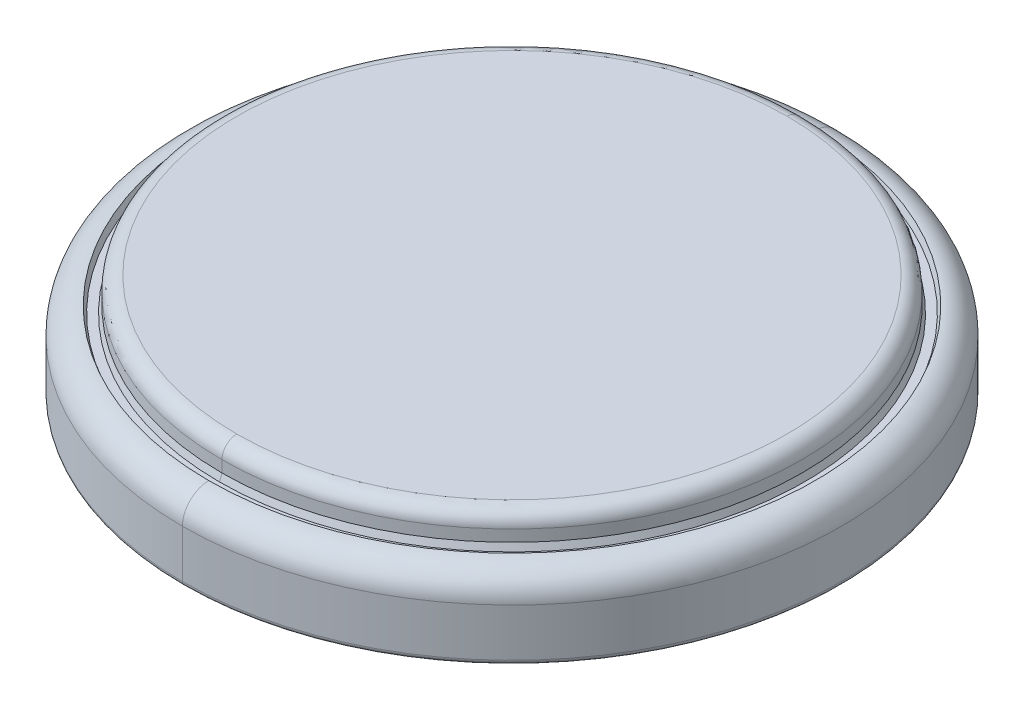
ISO-10303-21;
HEADER;
FILE_DESCRIPTION(('STEP AP214'),'2;1');
FILE_NAME('part.step','',(''),(''),'','','');
FILE_SCHEMA(('AUTOMOTIVE_DESIGN { 1 0 10303 214 1 1 1 1 }'));
ENDSEC;
DATA;
#1=APPLICATION_CONTEXT('core data for automotive mechanical design processes');
#2=APPLICATION_PROTOCOL_DEFINITION('international standard','automotive_design',2000,#1);
#3=PRODUCT_CONTEXT('',#1,'mechanical');
#4=PRODUCT('Part','Part','',(#3));
#5=PRODUCT_RELATED_PRODUCT_CATEGORY('part','',(#4));
#6=PRODUCT_DEFINITION_FORMATION('','',#4);
#7=PRODUCT_DEFINITION_CONTEXT('part definition',#1,'design');
#8=PRODUCT_DEFINITION('design','',#6,#7);
#9=PRODUCT_DEFINITION_SHAPE('','',#8);
#10=(LENGTH_UNIT() NAMED_UNIT(*) SI_UNIT(.MILLI.,.METRE.));
#11=(NAMED_UNIT(*) PLANE_ANGLE_UNIT() SI_UNIT($,.RADIAN.));
#12=(NAMED_UNIT(*) SI_UNIT($,.STERADIAN.) SOLID_ANGLE_UNIT());
#13=UNCERTAINTY_MEASURE_WITH_UNIT(LENGTH_MEASURE(1.E-05),#10,'distance_accuracy_value','');
#14=(GEOMETRIC_REPRESENTATION_CONTEXT(3) GLOBAL_UNCERTAINTY_ASSIGNED_CONTEXT((#13)) GLOBAL_UNIT_ASSIGNED_CONTEXT((#10,
#11,#12)) REPRESENTATION_CONTEXT('',''));
#15=CARTESIAN_POINT('',(0.,0.,0.));
#16=DIRECTION('',(0.,0.,1.));
#17=DIRECTION('',(1.,0.,0.));
#18=AXIS2_PLACEMENT_3D('',#15,#16,#17);
#19=CARTESIAN_POINT('',(0.,3.2,0.));
#20=DIRECTION('',(0.,-1.,0.));
#21=DIRECTION('',(0.,0.,-1.));
#22=AXIS2_PLACEMENT_3D('',#19,#20,#21);
#23=CYLINDRICAL_SURFACE('',#22,8.8);
#24=CARTESIAN_POINT('',(0.,2.75,0.));
#25=DIRECTION('',(0.,-1.,0.));
#26=DIRECTION('',(0.,0.,1.));
#27=AXIS2_PLACEMENT_3D('',#24,#25,#26);
#28=CIRCLE('',#27,8.8);
#29=CARTESIAN_POINT('',(0.,2.75,-8.8));
#30=VERTEX_POINT('',#29);
#31=CARTESIAN_POINT('',(0.,2.75,8.8));
#32=VERTEX_POINT('',#31);
#33=EDGE_CURVE('E11',#30,#32,#28,.T.);
#34=ORIENTED_EDGE('',*,*,#33,.T.);
#35=DIRECTION('',(0.,-1.,0.));
#36=VECTOR('',#35,1.);
#37=CARTESIAN_POINT('',(0.,3.2,8.8));
#38=LINE('',#37,#36);
#39=CARTESIAN_POINT('',(0.,2.4,8.8));
#40=VERTEX_POINT('',#39);
#41=EDGE_CURVE('E28',#32,#40,#38,.T.);
#42=ORIENTED_EDGE('',*,*,#41,.T.);
#43=CARTESIAN_POINT('',(0.,2.4,0.));
#44=DIRECTION('',(0.,1.,0.));
#45=DIRECTION('',(0.,0.,1.));
#46=AXIS2_PLACEMENT_3D('',#43,#44,#45);
#47=CIRCLE('',#46,8.8);
#48=CARTESIAN_POINT('',(0.,2.4,-8.8));
#49=VERTEX_POINT('',#48);
#50=EDGE_CURVE('E218',#40,#49,#47,.T.);
#51=ORIENTED_EDGE('',*,*,#50,.T.);
#52=DIRECTION('',(0.,-1.,0.));
#53=VECTOR('',#52,1.);
#54=CARTESIAN_POINT('',(0.,3.2,-8.8));
#55=LINE('',#54,#53);
#56=EDGE_CURVE('E251',#30,#49,#55,.T.);
#57=ORIENTED_EDGE('',*,*,#56,.F.);
#58=EDGE_LOOP('',(#34,#42,#51,#57));
#59=FACE_BOUND('',#58,.T.);
#60=ADVANCED_FACE('F17',(#59),#23,.T.);
#61=CARTESIAN_POINT('',(0.,2.75,0.));
#62=DIRECTION('',(0.,1.,0.));
#63=DIRECTION('',(0.,0.,1.));
#64=AXIS2_PLACEMENT_3D('',#61,#62,#63);
#65=TOROIDAL_SURFACE('',#64,8.35,0.45);
#66=ORIENTED_EDGE('',*,*,#33,.F.);
#67=CARTESIAN_POINT('',(0.,2.75,-8.35));
#68=DIRECTION('',(1.,0.,0.));
#69=DIRECTION('',(0.,0.,-1.));
#70=AXIS2_PLACEMENT_3D('',#67,#68,#69);
#71=CIRCLE('',#70,0.45);
#72=CARTESIAN_POINT('',(0.,3.2,-8.35));
#73=VERTEX_POINT('',#72);
#74=EDGE_CURVE('E212',#30,#73,#71,.T.);
#75=ORIENTED_EDGE('',*,*,#74,.T.);
#76=CARTESIAN_POINT('',(0.,3.2,0.));
#77=DIRECTION('',(0.,1.,0.));
#78=DIRECTION('',(0.,0.,1.));
#79=AXIS2_PLACEMENT_3D('',#76,#77,#78);
#80=CIRCLE('',#79,8.35);
#81=CARTESIAN_POINT('',(0.,3.2,8.35));
#82=VERTEX_POINT('',#81);
#83=EDGE_CURVE('E203',#82,#73,#80,.T.);
#84=ORIENTED_EDGE('',*,*,#83,.F.);
#85=CARTESIAN_POINT('',(0.,2.75,8.35));
#86=DIRECTION('',(-1.,0.,0.));
#87=DIRECTION('',(0.,0.,1.));
#88=AXIS2_PLACEMENT_3D('',#85,#86,#87);
#89=CIRCLE('',#88,0.45);
#90=EDGE_CURVE('E41',#32,#82,#89,.T.);
#91=ORIENTED_EDGE('',*,*,#90,.F.);
#92=EDGE_LOOP('',(#66,#75,#84,#91));
#93=FACE_BOUND('',#92,.T.);
#94=ADVANCED_FACE('F213',(#93),#65,.T.);
#95=CARTESIAN_POINT('',(0.,2.4,0.));
#96=DIRECTION('',(0.,-1.,0.));
#97=DIRECTION('',(0.,0.,1.));
#98=AXIS2_PLACEMENT_3D('',#95,#96,#97);
#99=CONICAL_SURFACE('',#98,8.8,0.349065850399);
#100=CARTESIAN_POINT('',(0.,2.4,0.));
#101=DIRECTION('',(0.,1.,0.));
#102=DIRECTION('',(0.,0.,1.));
#103=AXIS2_PLACEMENT_3D('',#100,#101,#102);
#104=CIRCLE('',#103,8.8);
#105=EDGE_CURVE('E248',#49,#40,#104,.T.);
#106=ORIENTED_EDGE('',*,*,#105,.F.);
#107=DIRECTION('',(0.,-0.939692620785813,-0.342020143325932));
#108=VECTOR('',#107,1.);
#109=CARTESIAN_POINT('',(0.,2.4,-8.8));
#110=LINE('',#109,#108);
#111=CARTESIAN_POINT('',(0.,2.2,-8.872794046853));
#112=VERTEX_POINT('',#111);
#113=EDGE_CURVE('E219',#49,#112,#110,.T.);
#114=ORIENTED_EDGE('',*,*,#113,.T.);
#115=CARTESIAN_POINT('',(0.,2.2,0.));
#116=DIRECTION('',(0.,1.,0.));
#117=DIRECTION('',(0.,0.,1.));
#118=AXIS2_PLACEMENT_3D('',#115,#116,#117);
#119=CIRCLE('',#118,8.872794046853);
#120=CARTESIAN_POINT('',(0.,2.2,8.872794046853));
#121=VERTEX_POINT('',#120);
#122=EDGE_CURVE('E75',#112,#121,#119,.T.);
#123=ORIENTED_EDGE('',*,*,#122,.T.);
#124=DIRECTION('',(0.,-0.939692620785813,0.342020143325932));
#125=VECTOR('',#124,1.);
#126=CARTESIAN_POINT('',(0.,2.4,8.8));
#127=LINE('',#126,#125);
#128=EDGE_CURVE('E89',#40,#121,#127,.T.);
#129=ORIENTED_EDGE('',*,*,#128,.F.);
#130=EDGE_LOOP('',(#106,#114,#123,#129));
#131=FACE_BOUND('',#130,.T.);
#132=ADVANCED_FACE('F263',(#131),#99,.T.);
#133=CARTESIAN_POINT('',(0.,2.4,0.));
#134=DIRECTION('',(0.,1.,0.));
#135=DIRECTION('',(0.,0.,1.));
#136=AXIS2_PLACEMENT_3D('',#133,#134,#135);
#137=CONICAL_SURFACE('',#136,9.2,0.349065850399);
#138=CARTESIAN_POINT('',(0.,2.2,0.));
#139=DIRECTION('',(0.,1.,0.));
#140=DIRECTION('',(0.,0.,1.));
#141=AXIS2_PLACEMENT_3D('',#138,#139,#140);
#142=CIRCLE('',#141,9.127205953147);
#143=CARTESIAN_POINT('',(0.,2.2,-9.127205953147));
#144=VERTEX_POINT('',#143);
#145=CARTESIAN_POINT('',(0.,2.2,9.127205953147));
#146=VERTEX_POINT('',#145);
#147=EDGE_CURVE('E152',#144,#146,#142,.T.);
#148=ORIENTED_EDGE('',*,*,#147,.F.);
#149=DIRECTION('',(0.,0.939692620785813,-0.342020143325932));
#150=VECTOR('',#149,1.);
#151=CARTESIAN_POINT('',(0.,2.4,-9.2));
#152=LINE('',#151,#150);
#153=CARTESIAN_POINT('',(0.,2.4,-9.2));
#154=VERTEX_POINT('',#153);
#155=EDGE_CURVE('E166',#144,#154,#152,.T.);
#156=ORIENTED_EDGE('',*,*,#155,.T.);
#157=CARTESIAN_POINT('',(0.,2.4,0.));
#158=DIRECTION('',(0.,1.,0.));
#159=DIRECTION('',(0.,0.,1.));
#160=AXIS2_PLACEMENT_3D('',#157,#158,#159);
#161=CIRCLE('',#160,9.2);
#162=CARTESIAN_POINT('',(0.,2.4,9.2));
#163=VERTEX_POINT('',#162);
#164=EDGE_CURVE('E238',#154,#163,#161,.T.);
#165=ORIENTED_EDGE('',*,*,#164,.T.);
#166=DIRECTION('',(0.,0.939692620785813,0.342020143325932));
#167=VECTOR('',#166,1.);
#168=CARTESIAN_POINT('',(0.,2.4,9.2));
#169=LINE('',#168,#167);
#170=EDGE_CURVE('E156',#146,#163,#169,.T.);
#171=ORIENTED_EDGE('',*,*,#170,.F.);
#172=EDGE_LOOP('',(#148,#156,#165,#171));
#173=FACE_BOUND('',#172,.T.);
#174=ADVANCED_FACE('F270',(#173),#137,.F.);
#175=CARTESIAN_POINT('',(0.,0.15,0.));
#176=DIRECTION('',(0.,1.,0.));
#177=DIRECTION('',(0.,0.,1.));
#178=AXIS2_PLACEMENT_3D('',#175,#176,#177);
#179=TOROIDAL_SURFACE('',#178,9.85,0.15);
#180=CARTESIAN_POINT('',(0.,0.,0.));
#181=DIRECTION('',(0.,-1.,0.));
#182=DIRECTION('',(0.,0.,1.));
#183=AXIS2_PLACEMENT_3D('',#180,#181,#182);
#184=CIRCLE('',#183,9.85);
#185=CARTESIAN_POINT('',(0.,0.,-9.85));
#186=VERTEX_POINT('',#185);
#187=CARTESIAN_POINT('',(0.,0.,9.85));
#188=VERTEX_POINT('',#187);
#189=EDGE_CURVE('E113',#186,#188,#184,.T.);
#190=ORIENTED_EDGE('',*,*,#189,.F.);
#191=CARTESIAN_POINT('',(0.,0.15,-9.85));
#192=DIRECTION('',(1.,0.,0.));
#193=DIRECTION('',(0.,0.,-1.));
#194=AXIS2_PLACEMENT_3D('',#191,#192,#193);
#195=CIRCLE('',#194,0.15);
#196=CARTESIAN_POINT('',(0.,0.15,-10.));
#197=VERTEX_POINT('',#196);
#198=EDGE_CURVE('E155',#186,#197,#195,.T.);
#199=ORIENTED_EDGE('',*,*,#198,.T.);
#200=CARTESIAN_POINT('',(0.,0.15,0.));
#201=DIRECTION('',(0.,1.,0.));
#202=DIRECTION('',(0.,0.,1.));
#203=AXIS2_PLACEMENT_3D('',#200,#201,#202);
#204=CIRCLE('',#203,10.);
#205=CARTESIAN_POINT('',(0.,0.15,10.));
#206=VERTEX_POINT('',#205);
#207=EDGE_CURVE('E129',#206,#197,#204,.T.);
#208=ORIENTED_EDGE('',*,*,#207,.F.);
#209=CARTESIAN_POINT('',(0.,0.15,9.85));
#210=DIRECTION('',(-1.,0.,0.));
#211=DIRECTION('',(0.,0.,1.));
#212=AXIS2_PLACEMENT_3D('',#209,#210,#211);
#213=CIRCLE('',#212,0.15);
#214=EDGE_CURVE('E21',#188,#206,#213,.T.);
#215=ORIENTED_EDGE('',*,*,#214,.F.);
#216=EDGE_LOOP('',(#190,#199,#208,#215));
#217=FACE_BOUND('',#216,.T.);
#218=ADVANCED_FACE('F284',(#217),#179,.T.);
#219=CARTESIAN_POINT('',(0.,1.6,0.));
#220=DIRECTION('',(0.,1.,0.));
#221=DIRECTION('',(0.,0.,1.));
#222=AXIS2_PLACEMENT_3D('',#219,#220,#221);
#223=TOROIDAL_SURFACE('',#222,9.2,0.8);
#224=CARTESIAN_POINT('',(0.,1.6,0.));
#225=DIRECTION('',(0.,-1.,0.));
#226=DIRECTION('',(0.,0.,1.));
#227=AXIS2_PLACEMENT_3D('',#224,#225,#226);
#228=CIRCLE('',#227,10.);
#229=CARTESIAN_POINT('',(0.,1.6,-10.));
#230=VERTEX_POINT('',#229);
#231=CARTESIAN_POINT('',(0.,1.6,10.));
#232=VERTEX_POINT('',#231);
#233=EDGE_CURVE('E104',#230,#232,#228,.T.);
#234=ORIENTED_EDGE('',*,*,#233,.F.);
#235=CARTESIAN_POINT('',(0.,1.6,-9.2));
#236=DIRECTION('',(1.,0.,0.));
#237=DIRECTION('',(0.,0.,-1.));
#238=AXIS2_PLACEMENT_3D('',#235,#236,#237);
#239=CIRCLE('',#238,0.8);
#240=EDGE_CURVE('E134',#230,#154,#239,.T.);
#241=ORIENTED_EDGE('',*,*,#240,.T.);
#242=CARTESIAN_POINT('',(0.,2.4,0.));
#243=DIRECTION('',(0.,1.,0.));
#244=DIRECTION('',(0.,0.,1.));
#245=AXIS2_PLACEMENT_3D('',#242,#243,#244);
#246=CIRCLE('',#245,9.2);
#247=EDGE_CURVE('E107',#163,#154,#246,.T.);
#248=ORIENTED_EDGE('',*,*,#247,.F.);
#249=CARTESIAN_POINT('',(0.,1.6,9.2));
#250=DIRECTION('',(-1.,0.,0.));
#251=DIRECTION('',(0.,0.,1.));
#252=AXIS2_PLACEMENT_3D('',#249,#250,#251);
#253=CIRCLE('',#252,0.8);
#254=EDGE_CURVE('E99',#232,#163,#253,.T.);
#255=ORIENTED_EDGE('',*,*,#254,.F.);
#256=EDGE_LOOP('',(#234,#241,#248,#255));
#257=FACE_BOUND('',#256,.T.);
#258=ADVANCED_FACE('F101',(#257),#223,.T.);
#259=CARTESIAN_POINT('',(0.,2.4,0.));
#260=DIRECTION('',(0.,-1.,0.));
#261=DIRECTION('',(0.,0.,-1.));
#262=AXIS2_PLACEMENT_3D('',#259,#260,#261);
#263=CYLINDRICAL_SURFACE('',#262,10.);
#264=ORIENTED_EDGE('',*,*,#233,.T.);
#265=DIRECTION('',(0.,-1.,0.));
#266=VECTOR('',#265,1.);
#267=CARTESIAN_POINT('',(0.,2.4,10.));
#268=LINE('',#267,#266);
#269=EDGE_CURVE('E119',#232,#206,#268,.T.);
#270=ORIENTED_EDGE('',*,*,#269,.T.);
#271=ORIENTED_EDGE('',*,*,#207,.T.);
#272=DIRECTION('',(0.,-1.,0.));
#273=VECTOR('',#272,1.);
#274=CARTESIAN_POINT('',(0.,2.4,-10.));
#275=LINE('',#274,#273);
#276=EDGE_CURVE('E132',#230,#197,#275,.T.);
#277=ORIENTED_EDGE('',*,*,#276,.F.);
#278=EDGE_LOOP('',(#264,#270,#271,#277));
#279=FACE_BOUND('',#278,.T.);
#280=ADVANCED_FACE('F131',(#279),#263,.T.);
#281=CARTESIAN_POINT('',(0.,2.4,0.));
#282=DIRECTION('',(0.,-1.,0.));
#283=DIRECTION('',(0.,0.,-1.));
#284=AXIS2_PLACEMENT_3D('',#281,#282,#283);
#285=CYLINDRICAL_SURFACE('',#284,10.);
#286=ORIENTED_EDGE('',*,*,#269,.F.);
#287=CARTESIAN_POINT('',(0.,1.6,0.));
#288=DIRECTION('',(0.,-1.,0.));
#289=DIRECTION('',(0.,0.,1.));
#290=AXIS2_PLACEMENT_3D('',#287,#288,#289);
#291=CIRCLE('',#290,10.);
#292=EDGE_CURVE('E122',#232,#230,#291,.T.);
#293=ORIENTED_EDGE('',*,*,#292,.T.);
#294=ORIENTED_EDGE('',*,*,#276,.T.);
#295=CARTESIAN_POINT('',(0.,0.15,0.));
#296=DIRECTION('',(0.,1.,0.));
#297=DIRECTION('',(0.,0.,1.));
#298=AXIS2_PLACEMENT_3D('',#295,#296,#297);
#299=CIRCLE('',#298,10.);
#300=EDGE_CURVE('E125',#197,#206,#299,.T.);
#301=ORIENTED_EDGE('',*,*,#300,.T.);
#302=EDGE_LOOP('',(#286,#293,#294,#301));
#303=FACE_BOUND('',#302,.T.);
#304=ADVANCED_FACE('F120',(#303),#285,.T.);
#305=CARTESIAN_POINT('',(0.,0.,0.));
#306=DIRECTION('',(0.,1.,0.));
#307=DIRECTION('',(1.,0.,0.));
#308=AXIS2_PLACEMENT_3D('',#305,#306,#307);
#309=PLANE('',#308);
#310=CARTESIAN_POINT('',(0.,0.,0.));
#311=DIRECTION('',(0.,-1.,0.));
#312=DIRECTION('',(0.,0.,1.));
#313=AXIS2_PLACEMENT_3D('',#310,#311,#312);
#314=CIRCLE('',#313,9.85);
#315=EDGE_CURVE('E147',#188,#186,#314,.T.);
#316=ORIENTED_EDGE('',*,*,#315,.T.);
#317=ORIENTED_EDGE('',*,*,#189,.T.);
#318=EDGE_LOOP('',(#316,#317));
#319=FACE_BOUND('',#318,.T.);
#320=ADVANCED_FACE('F282',(#319),#309,.F.);
#321=CARTESIAN_POINT('',(0.,1.6,0.));
#322=DIRECTION('',(0.,1.,0.));
#323=DIRECTION('',(0.,0.,1.));
#324=AXIS2_PLACEMENT_3D('',#321,#322,#323);
#325=TOROIDAL_SURFACE('',#324,9.2,0.8);
#326=ORIENTED_EDGE('',*,*,#240,.F.);
#327=ORIENTED_EDGE('',*,*,#292,.F.);
#328=ORIENTED_EDGE('',*,*,#254,.T.);
#329=ORIENTED_EDGE('',*,*,#164,.F.);
#330=EDGE_LOOP('',(#326,#327,#328,#329));
#331=FACE_BOUND('',#330,.T.);
#332=ADVANCED_FACE('F19',(#331),#325,.T.);
#333=CARTESIAN_POINT('',(0.,0.15,0.));
#334=DIRECTION('',(0.,1.,0.));
#335=DIRECTION('',(0.,0.,1.));
#336=AXIS2_PLACEMENT_3D('',#333,#334,#335);
#337=TOROIDAL_SURFACE('',#336,9.85,0.15);
#338=ORIENTED_EDGE('',*,*,#198,.F.);
#339=ORIENTED_EDGE('',*,*,#315,.F.);
#340=ORIENTED_EDGE('',*,*,#214,.T.);
#341=ORIENTED_EDGE('',*,*,#300,.F.);
#342=EDGE_LOOP('',(#338,#339,#340,#341));
#343=FACE_BOUND('',#342,.T.);
#344=ADVANCED_FACE('F283',(#343),#337,.T.);
#345=CARTESIAN_POINT('',(0.,2.4,0.));
#346=DIRECTION('',(0.,1.,0.));
#347=DIRECTION('',(0.,0.,1.));
#348=AXIS2_PLACEMENT_3D('',#345,#346,#347);
#349=CONICAL_SURFACE('',#348,9.2,0.349065850399);
#350=ORIENTED_EDGE('',*,*,#155,.F.);
#351=CARTESIAN_POINT('',(0.,2.2,0.));
#352=DIRECTION('',(0.,1.,0.));
#353=DIRECTION('',(0.,0.,1.));
#354=AXIS2_PLACEMENT_3D('',#351,#352,#353);
#355=CIRCLE('',#354,9.127205953147);
#356=EDGE_CURVE('E149',#146,#144,#355,.T.);
#357=ORIENTED_EDGE('',*,*,#356,.F.);
#358=ORIENTED_EDGE('',*,*,#170,.T.);
#359=ORIENTED_EDGE('',*,*,#247,.T.);
#360=EDGE_LOOP('',(#350,#357,#358,#359));
#361=FACE_BOUND('',#360,.T.);
#362=ADVANCED_FACE('F163',(#361),#349,.F.);
#363=CARTESIAN_POINT('',(0.,2.2,0.));
#364=DIRECTION('',(0.,1.,0.));
#365=DIRECTION('',(1.,0.,0.));
#366=AXIS2_PLACEMENT_3D('',#363,#364,#365);
#367=PLANE('',#366);
#368=CARTESIAN_POINT('',(0.,2.2,0.));
#369=DIRECTION('',(0.,1.,0.));
#370=DIRECTION('',(0.,0.,1.));
#371=AXIS2_PLACEMENT_3D('',#368,#369,#370);
#372=CIRCLE('',#371,8.872794046853);
#373=EDGE_CURVE('E209',#121,#112,#372,.T.);
#374=ORIENTED_EDGE('',*,*,#373,.F.);
#375=ORIENTED_EDGE('',*,*,#122,.F.);
#376=EDGE_LOOP('',(#374,#375));
#377=FACE_BOUND('',#376,.T.);
#378=ORIENTED_EDGE('',*,*,#356,.T.);
#379=ORIENTED_EDGE('',*,*,#147,.T.);
#380=EDGE_LOOP('',(#378,#379));
#381=FACE_BOUND('',#380,.T.);
#382=ADVANCED_FACE('F264',(#377,#381),#367,.T.);
#383=CARTESIAN_POINT('',(0.,2.4,0.));
#384=DIRECTION('',(0.,-1.,0.));
#385=DIRECTION('',(0.,0.,1.));
#386=AXIS2_PLACEMENT_3D('',#383,#384,#385);
#387=CONICAL_SURFACE('',#386,8.8,0.349065850399);
#388=ORIENTED_EDGE('',*,*,#113,.F.);
#389=ORIENTED_EDGE('',*,*,#50,.F.);
#390=ORIENTED_EDGE('',*,*,#128,.T.);
#391=ORIENTED_EDGE('',*,*,#373,.T.);
#392=EDGE_LOOP('',(#388,#389,#390,#391));
#393=FACE_BOUND('',#392,.T.);
#394=ADVANCED_FACE('F261',(#393),#387,.T.);
#395=CARTESIAN_POINT('',(0.,3.2,0.));
#396=DIRECTION('',(0.,1.,0.));
#397=DIRECTION('',(1.,0.,0.));
#398=AXIS2_PLACEMENT_3D('',#395,#396,#397);
#399=PLANE('',#398);
#400=ORIENTED_EDGE('',*,*,#83,.T.);
#401=CARTESIAN_POINT('',(0.,3.2,0.));
#402=DIRECTION('',(0.,1.,0.));
#403=DIRECTION('',(0.,0.,1.));
#404=AXIS2_PLACEMENT_3D('',#401,#402,#403);
#405=CIRCLE('',#404,8.35);
#406=EDGE_CURVE('E207',#73,#82,#405,.T.);
#407=ORIENTED_EDGE('',*,*,#406,.T.);
#408=EDGE_LOOP('',(#400,#407));
#409=FACE_BOUND('',#408,.T.);
#410=ADVANCED_FACE('F205',(#409),#399,.T.);
#411=CARTESIAN_POINT('',(0.,2.75,0.));
#412=DIRECTION('',(0.,1.,0.));
#413=DIRECTION('',(0.,0.,1.));
#414=AXIS2_PLACEMENT_3D('',#411,#412,#413);
#415=TOROIDAL_SURFACE('',#414,8.35,0.45);
#416=ORIENTED_EDGE('',*,*,#74,.F.);
#417=CARTESIAN_POINT('',(0.,2.75,0.));
#418=DIRECTION('',(0.,-1.,0.));
#419=DIRECTION('',(0.,0.,1.));
#420=AXIS2_PLACEMENT_3D('',#417,#418,#419);
#421=CIRCLE('',#420,8.8);
#422=EDGE_CURVE('E227',#32,#30,#421,.T.);
#423=ORIENTED_EDGE('',*,*,#422,.F.);
#424=ORIENTED_EDGE('',*,*,#90,.T.);
#425=ORIENTED_EDGE('',*,*,#406,.F.);
#426=EDGE_LOOP('',(#416,#423,#424,#425));
#427=FACE_BOUND('',#426,.T.);
#428=ADVANCED_FACE('F221',(#427),#415,.T.);
#429=CARTESIAN_POINT('',(0.,3.2,0.));
#430=DIRECTION('',(0.,-1.,0.));
#431=DIRECTION('',(0.,0.,-1.));
#432=AXIS2_PLACEMENT_3D('',#429,#430,#431);
#433=CYLINDRICAL_SURFACE('',#432,8.8);
#434=ORIENTED_EDGE('',*,*,#41,.F.);
#435=ORIENTED_EDGE('',*,*,#422,.T.);
#436=ORIENTED_EDGE('',*,*,#56,.T.);
#437=ORIENTED_EDGE('',*,*,#105,.T.);
#438=EDGE_LOOP('',(#434,#435,#436,#437));
#439=FACE_BOUND('',#438,.T.);
#440=ADVANCED_FACE('F257',(#439),#433,.T.);
#441=CLOSED_SHELL('',(#60,#94,#132,#174,#218,#258,#280,#304,#320,#332,#344,#362,#382,#394,#410,
#428,#440));
#442=MANIFOLD_SOLID_BREP('B1',#441);
#443=ADVANCED_BREP_SHAPE_REPRESENTATION('',(#18,#442),#14);
#444=SHAPE_DEFINITION_REPRESENTATION(#9,#443);
ENDSEC;
END-ISO-10303-21;
